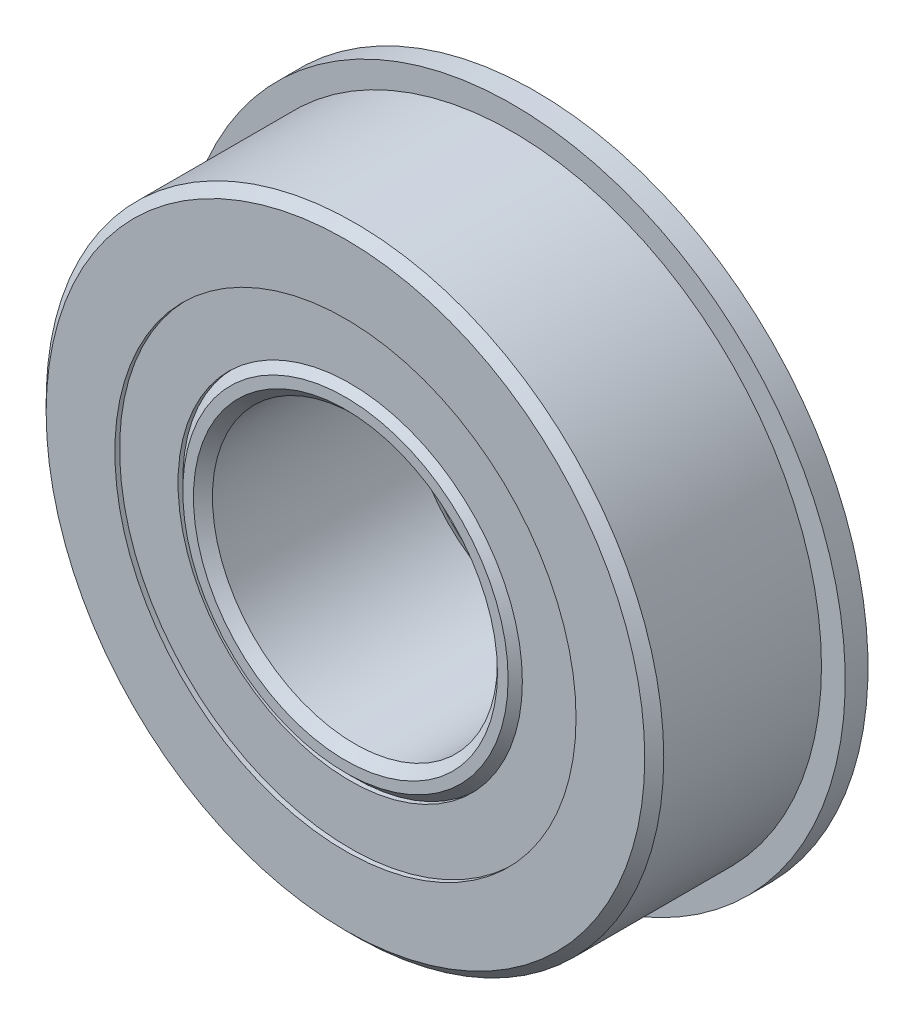
ISO-10303-21;
HEADER;
FILE_DESCRIPTION(('STEP AP214'),'2;1');
FILE_NAME('part.step','',(''),(''),'','','');
FILE_SCHEMA(('AUTOMOTIVE_DESIGN { 1 0 10303 214 1 1 1 1 }'));
ENDSEC;
DATA;
#1=APPLICATION_CONTEXT('core data for automotive mechanical design processes');
#2=APPLICATION_PROTOCOL_DEFINITION('international standard','automotive_design',2000,#1);
#3=PRODUCT_CONTEXT('',#1,'mechanical');
#4=PRODUCT('Part','Part','',(#3));
#5=PRODUCT_RELATED_PRODUCT_CATEGORY('part','',(#4));
#6=PRODUCT_DEFINITION_FORMATION('','',#4);
#7=PRODUCT_DEFINITION_CONTEXT('part definition',#1,'design');
#8=PRODUCT_DEFINITION('design','',#6,#7);
#9=PRODUCT_DEFINITION_SHAPE('','',#8);
#10=(LENGTH_UNIT() NAMED_UNIT(*) SI_UNIT(.MILLI.,.METRE.));
#11=(NAMED_UNIT(*) PLANE_ANGLE_UNIT() SI_UNIT($,.RADIAN.));
#12=(NAMED_UNIT(*) SI_UNIT($,.STERADIAN.) SOLID_ANGLE_UNIT());
#13=UNCERTAINTY_MEASURE_WITH_UNIT(LENGTH_MEASURE(1.E-05),#10,'distance_accuracy_value','');
#14=(GEOMETRIC_REPRESENTATION_CONTEXT(3) GLOBAL_UNCERTAINTY_ASSIGNED_CONTEXT((#13)) GLOBAL_UNIT_ASSIGNED_CONTEXT((#10,
#11,#12)) REPRESENTATION_CONTEXT('',''));
#15=CARTESIAN_POINT('',(0.,0.,0.));
#16=DIRECTION('',(0.,0.,1.));
#17=DIRECTION('',(1.,0.,0.));
#18=AXIS2_PLACEMENT_3D('',#15,#16,#17);
#19=CARTESIAN_POINT('',(0.,15.4103916666667,-6.0325));
#20=DIRECTION('',(0.,0.,1.));
#21=DIRECTION('',(1.,0.,0.));
#22=AXIS2_PLACEMENT_3D('',#19,#20,#21);
#23=PLANE('',#22);
#24=CARTESIAN_POINT('',(0.,0.,-6.0325));
#25=DIRECTION('',(0.,0.,1.));
#26=DIRECTION('',(1.,0.,0.));
#27=AXIS2_PLACEMENT_3D('',#24,#25,#26);
#28=CIRCLE('',#27,15.4103916666667);
#29=CARTESIAN_POINT('',(15.4103916666667,0.,-6.0325));
#30=VERTEX_POINT('',#29);
#31=EDGE_CURVE('E58',#30,#30,#28,.T.);
#32=ORIENTED_EDGE('',*,*,#31,.F.);
#33=EDGE_LOOP('',(#32));
#34=FACE_BOUND('',#33,.T.);
#35=CARTESIAN_POINT('',(0.,0.,-6.0325));
#36=DIRECTION('',(0.,0.,1.));
#37=DIRECTION('',(1.,0.,0.));
#38=AXIS2_PLACEMENT_3D('',#35,#36,#37);
#39=CIRCLE('',#38,11.5062);
#40=CARTESIAN_POINT('',(11.5062,0.,-6.0325));
#41=VERTEX_POINT('',#40);
#42=EDGE_CURVE('E11',#41,#41,#39,.T.);
#43=ORIENTED_EDGE('',*,*,#42,.T.);
#44=EDGE_LOOP('',(#43));
#45=FACE_BOUND('',#44,.T.);
#46=ADVANCED_FACE('F44',(#34,#45),#23,.F.);
#47=CARTESIAN_POINT('',(0.,0.,6.35));
#48=DIRECTION('',(0.,0.,1.));
#49=DIRECTION('',(1.,0.,0.));
#50=AXIS2_PLACEMENT_3D('',#47,#48,#49);
#51=CYLINDRICAL_SURFACE('',#50,11.5062);
#52=ORIENTED_EDGE('',*,*,#42,.F.);
#53=EDGE_LOOP('',(#52));
#54=FACE_BOUND('',#53,.T.);
#55=CARTESIAN_POINT('',(0.,0.,-2.26718517298678));
#56=DIRECTION('',(0.,0.,1.));
#57=DIRECTION('',(1.,0.,0.));
#58=AXIS2_PLACEMENT_3D('',#55,#56,#57);
#59=CIRCLE('',#58,11.5062);
#60=CARTESIAN_POINT('',(11.5062,0.,-2.26718517298678));
#61=VERTEX_POINT('',#60);
#62=EDGE_CURVE('E50',#61,#61,#59,.T.);
#63=ORIENTED_EDGE('',*,*,#62,.T.);
#64=EDGE_LOOP('',(#63));
#65=FACE_BOUND('',#64,.T.);
#66=ADVANCED_FACE('F67',(#54,#65),#51,.F.);
#67=CARTESIAN_POINT('',(0.,15.4103916666667,-2.26718517298678));
#68=DIRECTION('',(0.,0.,-1.));
#69=DIRECTION('',(-1.,0.,0.));
#70=AXIS2_PLACEMENT_3D('',#67,#68,#69);
#71=PLANE('',#70);
#72=ORIENTED_EDGE('',*,*,#62,.F.);
#73=EDGE_LOOP('',(#72));
#74=FACE_BOUND('',#73,.T.);
#75=CARTESIAN_POINT('',(0.,0.,-2.26718517298678));
#76=DIRECTION('',(0.,0.,1.));
#77=DIRECTION('',(1.,0.,0.));
#78=AXIS2_PLACEMENT_3D('',#75,#76,#77);
#79=CIRCLE('',#78,15.4103916666667);
#80=CARTESIAN_POINT('',(15.4103916666667,0.,-2.26718517298678));
#81=VERTEX_POINT('',#80);
#82=EDGE_CURVE('E54',#81,#81,#79,.T.);
#83=ORIENTED_EDGE('',*,*,#82,.T.);
#84=EDGE_LOOP('',(#83));
#85=FACE_BOUND('',#84,.T.);
#86=ADVANCED_FACE('F71',(#74,#85),#71,.F.);
#87=CARTESIAN_POINT('',(0.,0.,6.35));
#88=DIRECTION('',(0.,0.,1.));
#89=DIRECTION('',(1.,0.,0.));
#90=AXIS2_PLACEMENT_3D('',#87,#88,#89);
#91=CYLINDRICAL_SURFACE('',#90,15.4103916666667);
#92=ORIENTED_EDGE('',*,*,#82,.F.);
#93=EDGE_LOOP('',(#92));
#94=FACE_BOUND('',#93,.T.);
#95=ORIENTED_EDGE('',*,*,#31,.T.);
#96=EDGE_LOOP('',(#95));
#97=FACE_BOUND('',#96,.T.);
#98=ADVANCED_FACE('F64',(#94,#97),#91,.T.);
#99=CLOSED_SHELL('',(#46,#66,#86,#98));
#100=MANIFOLD_SOLID_BREP('B2',#99);
#101=CARTESIAN_POINT('',(0.,15.4103916666667,6.0325));
#102=DIRECTION('',(0.,0.,-1.));
#103=DIRECTION('',(-1.,0.,0.));
#104=AXIS2_PLACEMENT_3D('',#101,#102,#103);
#105=PLANE('',#104);
#106=CARTESIAN_POINT('',(0.,0.,6.0325));
#107=DIRECTION('',(0.,0.,1.));
#108=DIRECTION('',(1.,0.,0.));
#109=AXIS2_PLACEMENT_3D('',#106,#107,#108);
#110=CIRCLE('',#109,11.5062);
#111=CARTESIAN_POINT('',(11.5062,0.,6.0325));
#112=VERTEX_POINT('',#111);
#113=EDGE_CURVE('E43',#112,#112,#110,.T.);
#114=ORIENTED_EDGE('',*,*,#113,.F.);
#115=EDGE_LOOP('',(#114));
#116=FACE_BOUND('',#115,.T.);
#117=CARTESIAN_POINT('',(0.,0.,6.0325));
#118=DIRECTION('',(0.,0.,1.));
#119=DIRECTION('',(1.,0.,0.));
#120=AXIS2_PLACEMENT_3D('',#117,#118,#119);
#121=CIRCLE('',#120,15.4103916666667);
#122=CARTESIAN_POINT('',(15.4103916666667,0.,6.0325));
#123=VERTEX_POINT('',#122);
#124=EDGE_CURVE('E140',#123,#123,#121,.T.);
#125=ORIENTED_EDGE('',*,*,#124,.T.);
#126=EDGE_LOOP('',(#125));
#127=FACE_BOUND('',#126,.T.);
#128=ADVANCED_FACE('F126',(#116,#127),#105,.F.);
#129=CARTESIAN_POINT('',(0.,0.,6.35));
#130=DIRECTION('',(0.,0.,1.));
#131=DIRECTION('',(1.,0.,0.));
#132=AXIS2_PLACEMENT_3D('',#129,#130,#131);
#133=CYLINDRICAL_SURFACE('',#132,11.5062);
#134=CARTESIAN_POINT('',(0.,0.,2.26718517298678));
#135=DIRECTION('',(0.,0.,1.));
#136=DIRECTION('',(1.,0.,0.));
#137=AXIS2_PLACEMENT_3D('',#134,#135,#136);
#138=CIRCLE('',#137,11.5062);
#139=CARTESIAN_POINT('',(11.5062,0.,2.26718517298678));
#140=VERTEX_POINT('',#139);
#141=EDGE_CURVE('E132',#140,#140,#138,.T.);
#142=ORIENTED_EDGE('',*,*,#141,.F.);
#143=EDGE_LOOP('',(#142));
#144=FACE_BOUND('',#143,.T.);
#145=ORIENTED_EDGE('',*,*,#113,.T.);
#146=EDGE_LOOP('',(#145));
#147=FACE_BOUND('',#146,.T.);
#148=ADVANCED_FACE('F155',(#144,#147),#133,.F.);
#149=CARTESIAN_POINT('',(0.,15.4103916666667,2.26718517298678));
#150=DIRECTION('',(0.,0.,1.));
#151=DIRECTION('',(1.,0.,0.));
#152=AXIS2_PLACEMENT_3D('',#149,#150,#151);
#153=PLANE('',#152);
#154=CARTESIAN_POINT('',(0.,0.,2.26718517298678));
#155=DIRECTION('',(0.,0.,1.));
#156=DIRECTION('',(1.,0.,0.));
#157=AXIS2_PLACEMENT_3D('',#154,#155,#156);
#158=CIRCLE('',#157,15.4103916666667);
#159=CARTESIAN_POINT('',(15.4103916666667,0.,2.26718517298678));
#160=VERTEX_POINT('',#159);
#161=EDGE_CURVE('E136',#160,#160,#158,.T.);
#162=ORIENTED_EDGE('',*,*,#161,.F.);
#163=EDGE_LOOP('',(#162));
#164=FACE_BOUND('',#163,.T.);
#165=ORIENTED_EDGE('',*,*,#141,.T.);
#166=EDGE_LOOP('',(#165));
#167=FACE_BOUND('',#166,.T.);
#168=ADVANCED_FACE('F150',(#164,#167),#153,.F.);
#169=CARTESIAN_POINT('',(0.,0.,6.35));
#170=DIRECTION('',(0.,0.,1.));
#171=DIRECTION('',(1.,0.,0.));
#172=AXIS2_PLACEMENT_3D('',#169,#170,#171);
#173=CYLINDRICAL_SURFACE('',#172,15.4103916666667);
#174=ORIENTED_EDGE('',*,*,#124,.F.);
#175=EDGE_LOOP('',(#174));
#176=FACE_BOUND('',#175,.T.);
#177=ORIENTED_EDGE('',*,*,#161,.T.);
#178=EDGE_LOOP('',(#177));
#179=FACE_BOUND('',#178,.T.);
#180=ADVANCED_FACE('F147',(#176,#179),#173,.T.);
#181=CLOSED_SHELL('',(#128,#148,#168,#180));
#182=MANIFOLD_SOLID_BREP('B6',#181);
#183=CARTESIAN_POINT('',(-7.54062499999983,13.0607456208242,0.));
#184=DIRECTION('',(0.,0.,1.));
#185=DIRECTION('',(-0.499999999999989,0.866025403784445,0.));
#186=AXIS2_PLACEMENT_3D('',#183,#184,#185);
#187=SPHERICAL_SURFACE('',#186,4.23333333333334);
#188=CARTESIAN_POINT('',(-7.54062499999983,13.0607456208242,4.23333333333334));
#189=VERTEX_POINT('',#188);
#190=VERTEX_LOOP('',#189);
#191=FACE_BOUND('',#190,.T.);
#192=ADVANCED_FACE('F208',(#191),#187,.T.);
#193=CLOSED_SHELL('',(#192));
#194=MANIFOLD_SOLID_BREP('B38',#193);
#195=CARTESIAN_POINT('',(-13.060745620824,7.54062500000015,0.));
#196=DIRECTION('',(0.,0.,1.));
#197=DIRECTION('',(-0.866025403784433,0.50000000000001,0.));
#198=AXIS2_PLACEMENT_3D('',#195,#196,#197);
#199=SPHERICAL_SURFACE('',#198,4.23333333333334);
#200=CARTESIAN_POINT('',(-13.060745620824,7.54062500000015,4.23333333333334));
#201=VERTEX_POINT('',#200);
#202=VERTEX_LOOP('',#201);
#203=FACE_BOUND('',#202,.T.);
#204=ADVANCED_FACE('F229',(#203),#199,.T.);
#205=CLOSED_SHELL('',(#204));
#206=MANIFOLD_SOLID_BREP('B122',#205);
#207=CARTESIAN_POINT('',(-15.08125,1.57967708824284E-13,0.));
#208=DIRECTION('',(0.,0.,1.));
#209=DIRECTION('',(-1.,0.,0.));
#210=AXIS2_PLACEMENT_3D('',#207,#208,#209);
#211=SPHERICAL_SURFACE('',#210,4.23333333333334);
#212=CARTESIAN_POINT('',(-15.08125,1.57967708824284E-13,4.23333333333334));
#213=VERTEX_POINT('',#212);
#214=VERTEX_LOOP('',#213);
#215=FACE_BOUND('',#214,.T.);
#216=ADVANCED_FACE('F250',(#215),#211,.T.);
#217=CLOSED_SHELL('',(#216));
#218=MANIFOLD_SOLID_BREP('B204',#217);
#219=CARTESIAN_POINT('',(-13.0607456208241,-7.54062499999988,0.));
#220=DIRECTION('',(0.,0.,1.));
#221=DIRECTION('',(-0.866025403784443,-0.499999999999992,0.));
#222=AXIS2_PLACEMENT_3D('',#219,#220,#221);
#223=SPHERICAL_SURFACE('',#222,4.23333333333334);
#224=CARTESIAN_POINT('',(-13.0607456208241,-7.54062499999988,4.23333333333334));
#225=VERTEX_POINT('',#224);
#226=VERTEX_LOOP('',#225);
#227=FACE_BOUND('',#226,.T.);
#228=ADVANCED_FACE('F271',(#227),#223,.T.);
#229=CLOSED_SHELL('',(#228));
#230=MANIFOLD_SOLID_BREP('B225',#229);
#231=CARTESIAN_POINT('',(-7.54062500000011,-13.060745620824,0.));
#232=DIRECTION('',(0.,0.,1.));
#233=DIRECTION('',(-0.500000000000007,-0.866025403784435,0.));
#234=AXIS2_PLACEMENT_3D('',#231,#232,#233);
#235=SPHERICAL_SURFACE('',#234,4.23333333333334);
#236=CARTESIAN_POINT('',(-7.54062500000011,-13.060745620824,4.23333333333334));
#237=VERTEX_POINT('',#236);
#238=VERTEX_LOOP('',#237);
#239=FACE_BOUND('',#238,.T.);
#240=ADVANCED_FACE('F292',(#239),#235,.T.);
#241=CLOSED_SHELL('',(#240));
#242=MANIFOLD_SOLID_BREP('B246',#241);
#243=CARTESIAN_POINT('',(-1.05311805882856E-13,-15.08125,0.));
#244=DIRECTION('',(0.,0.,1.));
#245=DIRECTION('',(0.,-1.,0.));
#246=AXIS2_PLACEMENT_3D('',#243,#244,#245);
#247=SPHERICAL_SURFACE('',#246,4.23333333333334);
#248=CARTESIAN_POINT('',(-1.05311805882856E-13,-15.08125,4.23333333333334));
#249=VERTEX_POINT('',#248);
#250=VERTEX_LOOP('',#249);
#251=FACE_BOUND('',#250,.T.);
#252=ADVANCED_FACE('F313',(#251),#247,.T.);
#253=CLOSED_SHELL('',(#252));
#254=MANIFOLD_SOLID_BREP('B267',#253);
#255=CARTESIAN_POINT('',(7.54062499999992,-13.0607456208241,0.));
#256=DIRECTION('',(0.,0.,1.));
#257=DIRECTION('',(0.499999999999995,-0.866025403784442,0.));
#258=AXIS2_PLACEMENT_3D('',#255,#256,#257);
#259=SPHERICAL_SURFACE('',#258,4.23333333333334);
#260=CARTESIAN_POINT('',(7.54062499999992,-13.0607456208241,4.23333333333334));
#261=VERTEX_POINT('',#260);
#262=VERTEX_LOOP('',#261);
#263=FACE_BOUND('',#262,.T.);
#264=ADVANCED_FACE('F334',(#263),#259,.T.);
#265=CLOSED_SHELL('',(#264));
#266=MANIFOLD_SOLID_BREP('B288',#265);
#267=CARTESIAN_POINT('',(13.060745620824,-7.54062500000006,0.));
#268=DIRECTION('',(0.,0.,1.));
#269=DIRECTION('',(0.866025403784436,-0.500000000000004,0.));
#270=AXIS2_PLACEMENT_3D('',#267,#268,#269);
#271=SPHERICAL_SURFACE('',#270,4.23333333333334);
#272=CARTESIAN_POINT('',(13.060745620824,-7.54062500000006,4.23333333333334));
#273=VERTEX_POINT('',#272);
#274=VERTEX_LOOP('',#273);
#275=FACE_BOUND('',#274,.T.);
#276=ADVANCED_FACE('F355',(#275),#271,.T.);
#277=CLOSED_SHELL('',(#276));
#278=MANIFOLD_SOLID_BREP('B309',#277);
#279=CARTESIAN_POINT('',(15.08125,0.,0.));
#280=DIRECTION('',(0.,0.,1.));
#281=DIRECTION('',(1.,0.,0.));
#282=AXIS2_PLACEMENT_3D('',#279,#280,#281);
#283=SPHERICAL_SURFACE('',#282,4.23333333333334);
#284=CARTESIAN_POINT('',(15.08125,0.,4.23333333333334));
#285=VERTEX_POINT('',#284);
#286=VERTEX_LOOP('',#285);
#287=FACE_BOUND('',#286,.T.);
#288=ADVANCED_FACE('F376',(#287),#283,.T.);
#289=CLOSED_SHELL('',(#288));
#290=MANIFOLD_SOLID_BREP('B330',#289);
#291=CARTESIAN_POINT('',(13.0607456208241,7.54062499999997,0.));
#292=DIRECTION('',(0.,0.,1.));
#293=DIRECTION('',(0.86602540378444,0.499999999999998,0.));
#294=AXIS2_PLACEMENT_3D('',#291,#292,#293);
#295=SPHERICAL_SURFACE('',#294,4.23333333333334);
#296=CARTESIAN_POINT('',(13.0607456208241,7.54062499999997,4.23333333333334));
#297=VERTEX_POINT('',#296);
#298=VERTEX_LOOP('',#297);
#299=FACE_BOUND('',#298,.T.);
#300=ADVANCED_FACE('F397',(#299),#295,.T.);
#301=CLOSED_SHELL('',(#300));
#302=MANIFOLD_SOLID_BREP('B351',#301);
#303=CARTESIAN_POINT('',(7.54062500000002,13.0607456208241,0.));
#304=DIRECTION('',(0.,0.,1.));
#305=DIRECTION('',(0.500000000000001,0.866025403784438,0.));
#306=AXIS2_PLACEMENT_3D('',#303,#304,#305);
#307=SPHERICAL_SURFACE('',#306,4.23333333333334);
#308=CARTESIAN_POINT('',(7.54062500000002,13.0607456208241,4.23333333333334));
#309=VERTEX_POINT('',#308);
#310=VERTEX_LOOP('',#309);
#311=FACE_BOUND('',#310,.T.);
#312=ADVANCED_FACE('F418',(#311),#307,.T.);
#313=CLOSED_SHELL('',(#312));
#314=MANIFOLD_SOLID_BREP('B372',#313);
#315=CARTESIAN_POINT('',(0.,15.08125,0.));
#316=DIRECTION('',(0.,0.,1.));
#317=DIRECTION('',(0.,1.,0.));
#318=AXIS2_PLACEMENT_3D('',#315,#316,#317);
#319=SPHERICAL_SURFACE('',#318,4.23333333333334);
#320=CARTESIAN_POINT('',(0.,15.08125,4.23333333333334));
#321=VERTEX_POINT('',#320);
#322=VERTEX_LOOP('',#321);
#323=FACE_BOUND('',#322,.T.);
#324=ADVANCED_FACE('F441',(#323),#319,.T.);
#325=CLOSED_SHELL('',(#324));
#326=MANIFOLD_SOLID_BREP('B393',#325);
#327=CARTESIAN_POINT('',(0.,0.,5.715));
#328=DIRECTION('',(0.,0.,-1.));
#329=DIRECTION('',(-1.,0.,0.));
#330=AXIS2_PLACEMENT_3D('',#327,#328,#329);
#331=CONICAL_SURFACE('',#330,11.5062,0.785398163397447);
#332=CARTESIAN_POINT('',(0.,0.,6.35));
#333=DIRECTION('',(0.,0.,1.));
#334=DIRECTION('',(1.,0.,0.));
#335=AXIS2_PLACEMENT_3D('',#332,#333,#334);
#336=CIRCLE('',#335,10.8712);
#337=CARTESIAN_POINT('',(10.8712,0.,6.35));
#338=VERTEX_POINT('',#337);
#339=EDGE_CURVE('E440',#338,#338,#336,.T.);
#340=ORIENTED_EDGE('',*,*,#339,.F.);
#341=EDGE_LOOP('',(#340));
#342=FACE_BOUND('',#341,.T.);
#343=CARTESIAN_POINT('',(0.,0.,5.715));
#344=DIRECTION('',(0.,0.,1.));
#345=DIRECTION('',(1.,0.,0.));
#346=AXIS2_PLACEMENT_3D('',#343,#344,#345);
#347=CIRCLE('',#346,11.5062);
#348=CARTESIAN_POINT('',(11.5062,0.,5.715));
#349=VERTEX_POINT('',#348);
#350=EDGE_CURVE('E495',#349,#349,#347,.T.);
#351=ORIENTED_EDGE('',*,*,#350,.T.);
#352=EDGE_LOOP('',(#351));
#353=FACE_BOUND('',#352,.T.);
#354=ADVANCED_FACE('F461',(#342,#353),#331,.T.);
#355=CARTESIAN_POINT('',(0.,10.16,6.35));
#356=DIRECTION('',(0.,0.,-1.));
#357=DIRECTION('',(-1.,0.,0.));
#358=AXIS2_PLACEMENT_3D('',#355,#356,#357);
#359=PLANE('',#358);
#360=CARTESIAN_POINT('',(0.,0.,6.35));
#361=DIRECTION('',(0.,0.,1.));
#362=DIRECTION('',(1.,0.,0.));
#363=AXIS2_PLACEMENT_3D('',#360,#361,#362);
#364=CIRCLE('',#363,10.16);
#365=CARTESIAN_POINT('',(10.16,0.,6.35));
#366=VERTEX_POINT('',#365);
#367=EDGE_CURVE('E467',#366,#366,#364,.T.);
#368=ORIENTED_EDGE('',*,*,#367,.F.);
#369=EDGE_LOOP('',(#368));
#370=FACE_BOUND('',#369,.T.);
#371=ORIENTED_EDGE('',*,*,#339,.T.);
#372=EDGE_LOOP('',(#371));
#373=FACE_BOUND('',#372,.T.);
#374=ADVANCED_FACE('F544',(#370,#373),#359,.F.);
#375=CARTESIAN_POINT('',(0.,0.,6.35));
#376=DIRECTION('',(0.,0.,1.));
#377=DIRECTION('',(1.,0.,0.));
#378=AXIS2_PLACEMENT_3D('',#375,#376,#377);
#379=CONICAL_SURFACE('',#378,10.16,0.785398163397448);
#380=CARTESIAN_POINT('',(0.,0.,5.715));
#381=DIRECTION('',(0.,0.,1.));
#382=DIRECTION('',(1.,0.,0.));
#383=AXIS2_PLACEMENT_3D('',#380,#381,#382);
#384=CIRCLE('',#383,9.525);
#385=CARTESIAN_POINT('',(9.525,0.,5.715));
#386=VERTEX_POINT('',#385);
#387=EDGE_CURVE('E471',#386,#386,#384,.T.);
#388=ORIENTED_EDGE('',*,*,#387,.F.);
#389=EDGE_LOOP('',(#388));
#390=FACE_BOUND('',#389,.T.);
#391=ORIENTED_EDGE('',*,*,#367,.T.);
#392=EDGE_LOOP('',(#391));
#393=FACE_BOUND('',#392,.T.);
#394=ADVANCED_FACE('F539',(#390,#393),#379,.F.);
#395=CARTESIAN_POINT('',(0.,0.,6.35));
#396=DIRECTION('',(0.,0.,1.));
#397=DIRECTION('',(1.,0.,0.));
#398=AXIS2_PLACEMENT_3D('',#395,#396,#397);
#399=CYLINDRICAL_SURFACE('',#398,9.525);
#400=CARTESIAN_POINT('',(0.,0.,-7.3152));
#401=DIRECTION('',(0.,0.,1.));
#402=DIRECTION('',(1.,0.,0.));
#403=AXIS2_PLACEMENT_3D('',#400,#401,#402);
#404=CIRCLE('',#403,9.525);
#405=CARTESIAN_POINT('',(9.525,0.,-7.3152));
#406=VERTEX_POINT('',#405);
#407=EDGE_CURVE('E475',#406,#406,#404,.T.);
#408=ORIENTED_EDGE('',*,*,#407,.F.);
#409=EDGE_LOOP('',(#408));
#410=FACE_BOUND('',#409,.T.);
#411=ORIENTED_EDGE('',*,*,#387,.T.);
#412=EDGE_LOOP('',(#411));
#413=FACE_BOUND('',#412,.T.);
#414=ADVANCED_FACE('F533',(#410,#413),#399,.F.);
#415=CARTESIAN_POINT('',(0.,0.,-7.3152));
#416=DIRECTION('',(0.,0.,-1.));
#417=DIRECTION('',(-1.,0.,0.));
#418=AXIS2_PLACEMENT_3D('',#415,#416,#417);
#419=CONICAL_SURFACE('',#418,9.525,0.785398163397446);
#420=CARTESIAN_POINT('',(0.,0.,-7.9502));
#421=DIRECTION('',(0.,0.,1.));
#422=DIRECTION('',(1.,0.,0.));
#423=AXIS2_PLACEMENT_3D('',#420,#421,#422);
#424=CIRCLE('',#423,10.16);
#425=CARTESIAN_POINT('',(10.16,0.,-7.9502));
#426=VERTEX_POINT('',#425);
#427=EDGE_CURVE('E480',#426,#426,#424,.T.);
#428=ORIENTED_EDGE('',*,*,#427,.F.);
#429=EDGE_LOOP('',(#428));
#430=FACE_BOUND('',#429,.T.);
#431=ORIENTED_EDGE('',*,*,#407,.T.);
#432=EDGE_LOOP('',(#431));
#433=FACE_BOUND('',#432,.T.);
#434=ADVANCED_FACE('F527',(#430,#433),#419,.F.);
#435=CARTESIAN_POINT('',(0.,10.8712,-7.9502));
#436=DIRECTION('',(0.,0.,1.));
#437=DIRECTION('',(1.,0.,0.));
#438=AXIS2_PLACEMENT_3D('',#435,#436,#437);
#439=PLANE('',#438);
#440=CARTESIAN_POINT('',(0.,0.,-7.9502));
#441=DIRECTION('',(0.,0.,1.));
#442=DIRECTION('',(1.,0.,0.));
#443=AXIS2_PLACEMENT_3D('',#440,#441,#442);
#444=CIRCLE('',#443,10.8712);
#445=CARTESIAN_POINT('',(10.8712,0.,-7.9502));
#446=VERTEX_POINT('',#445);
#447=EDGE_CURVE('E483',#446,#446,#444,.T.);
#448=ORIENTED_EDGE('',*,*,#447,.F.);
#449=EDGE_LOOP('',(#448));
#450=FACE_BOUND('',#449,.T.);
#451=ORIENTED_EDGE('',*,*,#427,.T.);
#452=EDGE_LOOP('',(#451));
#453=FACE_BOUND('',#452,.T.);
#454=ADVANCED_FACE('F521',(#450,#453),#439,.F.);
#455=CARTESIAN_POINT('',(0.,0.,-7.9502));
#456=DIRECTION('',(0.,0.,1.));
#457=DIRECTION('',(1.,0.,0.));
#458=AXIS2_PLACEMENT_3D('',#455,#456,#457);
#459=CONICAL_SURFACE('',#458,10.8712,0.785398163397448);
#460=CARTESIAN_POINT('',(0.,0.,-7.3152));
#461=DIRECTION('',(0.,0.,1.));
#462=DIRECTION('',(1.,0.,0.));
#463=AXIS2_PLACEMENT_3D('',#460,#461,#462);
#464=CIRCLE('',#463,11.5062);
#465=CARTESIAN_POINT('',(11.5062,0.,-7.3152));
#466=VERTEX_POINT('',#465);
#467=EDGE_CURVE('E486',#466,#466,#464,.T.);
#468=ORIENTED_EDGE('',*,*,#467,.F.);
#469=EDGE_LOOP('',(#468));
#470=FACE_BOUND('',#469,.T.);
#471=ORIENTED_EDGE('',*,*,#447,.T.);
#472=EDGE_LOOP('',(#471));
#473=FACE_BOUND('',#472,.T.);
#474=ADVANCED_FACE('F515',(#470,#473),#459,.T.);
#475=CARTESIAN_POINT('',(0.,0.,6.35));
#476=DIRECTION('',(0.,0.,1.));
#477=DIRECTION('',(1.,0.,0.));
#478=AXIS2_PLACEMENT_3D('',#475,#476,#477);
#479=CYLINDRICAL_SURFACE('',#478,11.5062);
#480=CARTESIAN_POINT('',(0.,0.,-2.26718517298678));
#481=DIRECTION('',(0.,0.,1.));
#482=DIRECTION('',(1.,0.,0.));
#483=AXIS2_PLACEMENT_3D('',#480,#481,#482);
#484=CIRCLE('',#483,11.5062);
#485=CARTESIAN_POINT('',(11.5062,0.,-2.26718517298678));
#486=VERTEX_POINT('',#485);
#487=EDGE_CURVE('E489',#486,#486,#484,.T.);
#488=ORIENTED_EDGE('',*,*,#487,.F.);
#489=EDGE_LOOP('',(#488));
#490=FACE_BOUND('',#489,.T.);
#491=ORIENTED_EDGE('',*,*,#467,.T.);
#492=EDGE_LOOP('',(#491));
#493=FACE_BOUND('',#492,.T.);
#494=ADVANCED_FACE('F509',(#490,#493),#479,.T.);
#495=CARTESIAN_POINT('',(0.,0.,0.));
#496=DIRECTION('',(0.,0.,1.));
#497=DIRECTION('',(1.,0.,0.));
#498=AXIS2_PLACEMENT_3D('',#495,#496,#497);
#499=TOROIDAL_SURFACE('',#498,15.08125,4.23333333333333);
#500=CARTESIAN_POINT('',(0.,0.,2.26718517298678));
#501=DIRECTION('',(0.,0.,1.));
#502=DIRECTION('',(1.,0.,0.));
#503=AXIS2_PLACEMENT_3D('',#500,#501,#502);
#504=CIRCLE('',#503,11.5062);
#505=CARTESIAN_POINT('',(11.5062,0.,2.26718517298678));
#506=VERTEX_POINT('',#505);
#507=EDGE_CURVE('E492',#506,#506,#504,.T.);
#508=ORIENTED_EDGE('',*,*,#507,.F.);
#509=EDGE_LOOP('',(#508));
#510=FACE_BOUND('',#509,.T.);
#511=ORIENTED_EDGE('',*,*,#487,.T.);
#512=EDGE_LOOP('',(#511));
#513=FACE_BOUND('',#512,.T.);
#514=ADVANCED_FACE('F503',(#510,#513),#499,.F.);
#515=CARTESIAN_POINT('',(0.,0.,6.35));
#516=DIRECTION('',(0.,0.,1.));
#517=DIRECTION('',(1.,0.,0.));
#518=AXIS2_PLACEMENT_3D('',#515,#516,#517);
#519=CYLINDRICAL_SURFACE('',#518,11.5062);
#520=ORIENTED_EDGE('',*,*,#350,.F.);
#521=EDGE_LOOP('',(#520));
#522=FACE_BOUND('',#521,.T.);
#523=ORIENTED_EDGE('',*,*,#507,.T.);
#524=EDGE_LOOP('',(#523));
#525=FACE_BOUND('',#524,.T.);
#526=ADVANCED_FACE('F500',(#522,#525),#519,.T.);
#527=CLOSED_SHELL('',(#354,#374,#394,#414,#434,#454,#474,#494,#514,#526));
#528=MANIFOLD_SOLID_BREP('B414',#527);
#529=CARTESIAN_POINT('',(0.,0.,5.715));
#530=DIRECTION('',(0.,0.,-1.));
#531=DIRECTION('',(-1.,0.,0.));
#532=AXIS2_PLACEMENT_3D('',#529,#530,#531);
#533=CONICAL_SURFACE('',#532,20.6375,0.785398163397446);
#534=CARTESIAN_POINT('',(0.,0.,6.35));
#535=DIRECTION('',(0.,0.,1.));
#536=DIRECTION('',(1.,0.,0.));
#537=AXIS2_PLACEMENT_3D('',#534,#535,#536);
#538=CIRCLE('',#537,20.0025);
#539=CARTESIAN_POINT('',(20.0025,0.,6.35));
#540=VERTEX_POINT('',#539);
#541=EDGE_CURVE('E635',#540,#540,#538,.T.);
#542=ORIENTED_EDGE('',*,*,#541,.F.);
#543=EDGE_LOOP('',(#542));
#544=FACE_BOUND('',#543,.T.);
#545=CARTESIAN_POINT('',(0.,0.,5.715));
#546=DIRECTION('',(0.,0.,1.));
#547=DIRECTION('',(1.,0.,0.));
#548=AXIS2_PLACEMENT_3D('',#545,#546,#547);
#549=CIRCLE('',#548,20.6375);
#550=CARTESIAN_POINT('',(20.6375,0.,5.715));
#551=VERTEX_POINT('',#550);
#552=EDGE_CURVE('E460',#551,#551,#549,.T.);
#553=ORIENTED_EDGE('',*,*,#552,.T.);
#554=EDGE_LOOP('',(#553));
#555=FACE_BOUND('',#554,.T.);
#556=ADVANCED_FACE('F613',(#544,#555),#533,.T.);
#557=CARTESIAN_POINT('',(0.,0.,6.35));
#558=DIRECTION('',(0.,0.,1.));
#559=DIRECTION('',(1.,0.,0.));
#560=AXIS2_PLACEMENT_3D('',#557,#558,#559);
#561=CYLINDRICAL_SURFACE('',#560,20.6375);
#562=CARTESIAN_POINT('',(0.,0.,-4.826));
#563=DIRECTION('',(0.,0.,1.));
#564=DIRECTION('',(1.,0.,0.));
#565=AXIS2_PLACEMENT_3D('',#562,#563,#564);
#566=CIRCLE('',#565,20.6375);
#567=CARTESIAN_POINT('',(20.6375,0.,-4.826));
#568=VERTEX_POINT('',#567);
#569=EDGE_CURVE('E638',#568,#568,#566,.T.);
#570=ORIENTED_EDGE('',*,*,#569,.T.);
#571=EDGE_LOOP('',(#570));
#572=FACE_BOUND('',#571,.T.);
#573=ORIENTED_EDGE('',*,*,#552,.F.);
#574=EDGE_LOOP('',(#573));
#575=FACE_BOUND('',#574,.T.);
#576=ADVANCED_FACE('F658',(#572,#575),#561,.T.);
#577=CARTESIAN_POINT('',(0.,20.0025,-6.35));
#578=DIRECTION('',(0.,0.,1.));
#579=DIRECTION('',(1.,0.,0.));
#580=AXIS2_PLACEMENT_3D('',#577,#578,#579);
#581=PLANE('',#580);
#582=CARTESIAN_POINT('',(0.,0.,-6.35));
#583=DIRECTION('',(0.,0.,1.));
#584=DIRECTION('',(1.,0.,0.));
#585=AXIS2_PLACEMENT_3D('',#582,#583,#584);
#586=CIRCLE('',#585,15.4103916666667);
#587=CARTESIAN_POINT('',(15.4103916666667,0.,-6.35));
#588=VERTEX_POINT('',#587);
#589=EDGE_CURVE('E619',#588,#588,#586,.T.);
#590=ORIENTED_EDGE('',*,*,#589,.T.);
#591=EDGE_LOOP('',(#590));
#592=FACE_BOUND('',#591,.T.);
#593=CARTESIAN_POINT('',(0.,0.,-6.35));
#594=DIRECTION('',(0.,0.,-1.));
#595=DIRECTION('',(-1.,0.,0.));
#596=AXIS2_PLACEMENT_3D('',#593,#594,#595);
#597=CIRCLE('',#596,22.225);
#598=CARTESIAN_POINT('',(-22.225,0.,-6.35));
#599=VERTEX_POINT('',#598);
#600=EDGE_CURVE('E641',#599,#599,#597,.T.);
#601=ORIENTED_EDGE('',*,*,#600,.T.);
#602=EDGE_LOOP('',(#601));
#603=FACE_BOUND('',#602,.T.);
#604=ADVANCED_FACE('F661',(#592,#603),#581,.F.);
#605=CARTESIAN_POINT('',(0.,0.,6.35));
#606=DIRECTION('',(0.,0.,1.));
#607=DIRECTION('',(1.,0.,0.));
#608=AXIS2_PLACEMENT_3D('',#605,#606,#607);
#609=CYLINDRICAL_SURFACE('',#608,15.4103916666667);
#610=CARTESIAN_POINT('',(0.,0.,-4.22051855515114));
#611=DIRECTION('',(0.,0.,1.));
#612=DIRECTION('',(1.,0.,0.));
#613=AXIS2_PLACEMENT_3D('',#610,#611,#612);
#614=CIRCLE('',#613,15.4103916666667);
#615=CARTESIAN_POINT('',(15.4103916666667,0.,-4.22051855515114));
#616=VERTEX_POINT('',#615);
#617=EDGE_CURVE('E623',#616,#616,#614,.T.);
#618=ORIENTED_EDGE('',*,*,#617,.T.);
#619=EDGE_LOOP('',(#618));
#620=FACE_BOUND('',#619,.T.);
#621=ORIENTED_EDGE('',*,*,#589,.F.);
#622=EDGE_LOOP('',(#621));
#623=FACE_BOUND('',#622,.T.);
#624=ADVANCED_FACE('F666',(#620,#623),#609,.F.);
#625=CARTESIAN_POINT('',(0.,0.,0.));
#626=DIRECTION('',(0.,0.,1.));
#627=DIRECTION('',(1.,0.,0.));
#628=AXIS2_PLACEMENT_3D('',#625,#626,#627);
#629=TOROIDAL_SURFACE('',#628,15.08125,4.23333333333334);
#630=ORIENTED_EDGE('',*,*,#617,.F.);
#631=EDGE_LOOP('',(#630));
#632=FACE_BOUND('',#631,.T.);
#633=CARTESIAN_POINT('',(0.,0.,4.22051855515114));
#634=DIRECTION('',(0.,0.,1.));
#635=DIRECTION('',(1.,0.,0.));
#636=AXIS2_PLACEMENT_3D('',#633,#634,#635);
#637=CIRCLE('',#636,15.4103916666667);
#638=CARTESIAN_POINT('',(15.4103916666667,0.,4.22051855515114));
#639=VERTEX_POINT('',#638);
#640=EDGE_CURVE('E627',#639,#639,#637,.T.);
#641=ORIENTED_EDGE('',*,*,#640,.T.);
#642=EDGE_LOOP('',(#641));
#643=FACE_BOUND('',#642,.T.);
#644=ADVANCED_FACE('F672',(#632,#643),#629,.F.);
#645=CARTESIAN_POINT('',(0.,0.,6.35));
#646=DIRECTION('',(0.,0.,1.));
#647=DIRECTION('',(1.,0.,0.));
#648=AXIS2_PLACEMENT_3D('',#645,#646,#647);
#649=CYLINDRICAL_SURFACE('',#648,15.4103916666667);
#650=ORIENTED_EDGE('',*,*,#640,.F.);
#651=EDGE_LOOP('',(#650));
#652=FACE_BOUND('',#651,.T.);
#653=CARTESIAN_POINT('',(0.,0.,6.35));
#654=DIRECTION('',(0.,0.,1.));
#655=DIRECTION('',(1.,0.,0.));
#656=AXIS2_PLACEMENT_3D('',#653,#654,#655);
#657=CIRCLE('',#656,15.4103916666667);
#658=CARTESIAN_POINT('',(15.4103916666667,0.,6.35));
#659=VERTEX_POINT('',#658);
#660=EDGE_CURVE('E632',#659,#659,#657,.T.);
#661=ORIENTED_EDGE('',*,*,#660,.T.);
#662=EDGE_LOOP('',(#661));
#663=FACE_BOUND('',#662,.T.);
#664=ADVANCED_FACE('F676',(#652,#663),#649,.F.);
#665=CARTESIAN_POINT('',(0.,20.0025,6.35));
#666=DIRECTION('',(0.,0.,-1.));
#667=DIRECTION('',(-1.,0.,0.));
#668=AXIS2_PLACEMENT_3D('',#665,#666,#667);
#669=PLANE('',#668);
#670=ORIENTED_EDGE('',*,*,#660,.F.);
#671=EDGE_LOOP('',(#670));
#672=FACE_BOUND('',#671,.T.);
#673=ORIENTED_EDGE('',*,*,#541,.T.);
#674=EDGE_LOOP('',(#673));
#675=FACE_BOUND('',#674,.T.);
#676=ADVANCED_FACE('F654',(#672,#675),#669,.F.);
#677=CARTESIAN_POINT('',(0.,15.4103916666667,-4.826));
#678=DIRECTION('',(0.,0.,1.));
#679=DIRECTION('',(1.,0.,0.));
#680=AXIS2_PLACEMENT_3D('',#677,#678,#679);
#681=PLANE('',#680);
#682=CARTESIAN_POINT('',(0.,0.,-4.826));
#683=DIRECTION('',(0.,0.,-1.));
#684=DIRECTION('',(-1.,0.,0.));
#685=AXIS2_PLACEMENT_3D('',#682,#683,#684);
#686=CIRCLE('',#685,22.225);
#687=CARTESIAN_POINT('',(-22.225,0.,-4.826));
#688=VERTEX_POINT('',#687);
#689=EDGE_CURVE('E644',#688,#688,#686,.T.);
#690=ORIENTED_EDGE('',*,*,#689,.F.);
#691=EDGE_LOOP('',(#690));
#692=FACE_BOUND('',#691,.T.);
#693=ORIENTED_EDGE('',*,*,#569,.F.);
#694=EDGE_LOOP('',(#693));
#695=FACE_BOUND('',#694,.T.);
#696=ADVANCED_FACE('F651',(#692,#695),#681,.T.);
#697=CARTESIAN_POINT('',(0.,0.,-6.35));
#698=DIRECTION('',(0.,0.,-1.));
#699=DIRECTION('',(-1.,0.,0.));
#700=AXIS2_PLACEMENT_3D('',#697,#698,#699);
#701=CYLINDRICAL_SURFACE('',#700,22.225);
#702=ORIENTED_EDGE('',*,*,#689,.T.);
#703=EDGE_LOOP('',(#702));
#704=FACE_BOUND('',#703,.T.);
#705=ORIENTED_EDGE('',*,*,#600,.F.);
#706=EDGE_LOOP('',(#705));
#707=FACE_BOUND('',#706,.T.);
#708=ADVANCED_FACE('F648',(#704,#707),#701,.T.);
#709=CLOSED_SHELL('',(#556,#576,#604,#624,#644,#664,#676,#696,#708));
#710=MANIFOLD_SOLID_BREP('B435',#709);
#711=ADVANCED_BREP_SHAPE_REPRESENTATION('',(#18,#100,#182,#194,#206,#218,#230,#242,#254,#266,
#278,#290,#302,#314,#326,#528,#710),#14);
#712=SHAPE_DEFINITION_REPRESENTATION(#9,#711);
ENDSEC;
END-ISO-10303-21;
